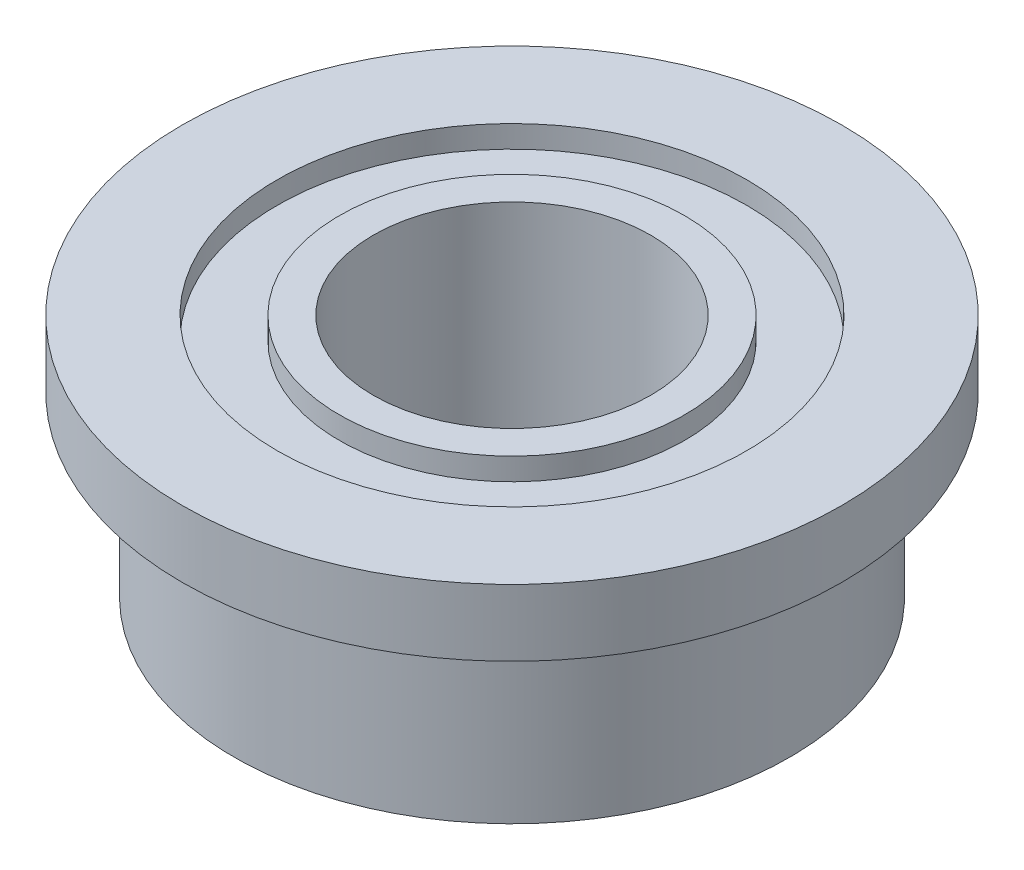
ISO-10303-21;
HEADER;
FILE_DESCRIPTION(('STEP AP214'),'2;1');
FILE_NAME('part.step','',(''),(''),'','','');
FILE_SCHEMA(('AUTOMOTIVE_DESIGN { 1 0 10303 214 1 1 1 1 }'));
ENDSEC;
DATA;
#1=APPLICATION_CONTEXT('core data for automotive mechanical design processes');
#2=APPLICATION_PROTOCOL_DEFINITION('international standard','automotive_design',2000,#1);
#3=PRODUCT_CONTEXT('',#1,'mechanical');
#4=PRODUCT('Part','Part','',(#3));
#5=PRODUCT_RELATED_PRODUCT_CATEGORY('part','',(#4));
#6=PRODUCT_DEFINITION_FORMATION('','',#4);
#7=PRODUCT_DEFINITION_CONTEXT('part definition',#1,'design');
#8=PRODUCT_DEFINITION('design','',#6,#7);
#9=PRODUCT_DEFINITION_SHAPE('','',#8);
#10=(LENGTH_UNIT() NAMED_UNIT(*) SI_UNIT(.MILLI.,.METRE.));
#11=(NAMED_UNIT(*) PLANE_ANGLE_UNIT() SI_UNIT($,.RADIAN.));
#12=(NAMED_UNIT(*) SI_UNIT($,.STERADIAN.) SOLID_ANGLE_UNIT());
#13=UNCERTAINTY_MEASURE_WITH_UNIT(LENGTH_MEASURE(1.E-05),#10,'distance_accuracy_value','');
#14=(GEOMETRIC_REPRESENTATION_CONTEXT(3) GLOBAL_UNCERTAINTY_ASSIGNED_CONTEXT((#13)) GLOBAL_UNIT_ASSIGNED_CONTEXT((#10,
#11,#12)) REPRESENTATION_CONTEXT('',''));
#15=CARTESIAN_POINT('',(0.,0.,0.));
#16=DIRECTION('',(0.,0.,1.));
#17=DIRECTION('',(1.,0.,0.));
#18=AXIS2_PLACEMENT_3D('',#15,#16,#17);
#19=CARTESIAN_POINT('',(0.,2.794,0.));
#20=DIRECTION('',(0.,-1.,0.));
#21=DIRECTION('',(0.,0.,-1.));
#22=AXIS2_PLACEMENT_3D('',#19,#20,#21);
#23=CYLINDRICAL_SURFACE('',#22,1.97485);
#24=CARTESIAN_POINT('',(0.,0.254,0.));
#25=DIRECTION('',(0.,-1.,0.));
#26=DIRECTION('',(0.,0.,-1.));
#27=AXIS2_PLACEMENT_3D('',#24,#25,#26);
#28=CIRCLE('',#27,1.97485);
#29=CARTESIAN_POINT('',(0.,0.254,-1.97485));
#30=VERTEX_POINT('',#29);
#31=EDGE_CURVE('E82',#30,#30,#28,.T.);
#32=ORIENTED_EDGE('',*,*,#31,.T.);
#33=EDGE_LOOP('',(#32));
#34=FACE_BOUND('',#33,.T.);
#35=CARTESIAN_POINT('',(0.,0.,0.));
#36=DIRECTION('',(0.,-1.,0.));
#37=DIRECTION('',(0.,0.,-1.));
#38=AXIS2_PLACEMENT_3D('',#35,#36,#37);
#39=CIRCLE('',#38,1.97485);
#40=CARTESIAN_POINT('',(0.,0.,-1.97485));
#41=VERTEX_POINT('',#40);
#42=EDGE_CURVE('E10',#41,#41,#39,.T.);
#43=ORIENTED_EDGE('',*,*,#42,.F.);
#44=EDGE_LOOP('',(#43));
#45=FACE_BOUND('',#44,.T.);
#46=ADVANCED_FACE('F30',(#34,#45),#23,.T.);
#47=CARTESIAN_POINT('',(1.5875,0.,0.));
#48=DIRECTION('',(0.,-1.,0.));
#49=DIRECTION('',(0.,0.,-1.));
#50=AXIS2_PLACEMENT_3D('',#47,#48,#49);
#51=PLANE('',#50);
#52=ORIENTED_EDGE('',*,*,#42,.T.);
#53=EDGE_LOOP('',(#52));
#54=FACE_BOUND('',#53,.T.);
#55=CARTESIAN_POINT('',(0.,0.,0.));
#56=DIRECTION('',(0.,-1.,0.));
#57=DIRECTION('',(0.,0.,-1.));
#58=AXIS2_PLACEMENT_3D('',#55,#56,#57);
#59=CIRCLE('',#58,1.5875);
#60=CARTESIAN_POINT('',(0.,0.,-1.5875));
#61=VERTEX_POINT('',#60);
#62=EDGE_CURVE('E36',#61,#61,#59,.T.);
#63=ORIENTED_EDGE('',*,*,#62,.F.);
#64=EDGE_LOOP('',(#63));
#65=FACE_BOUND('',#64,.T.);
#66=ADVANCED_FACE('F100',(#54,#65),#51,.T.);
#67=CARTESIAN_POINT('',(0.,2.794,0.));
#68=DIRECTION('',(0.,-1.,0.));
#69=DIRECTION('',(0.,0.,-1.));
#70=AXIS2_PLACEMENT_3D('',#67,#68,#69);
#71=CYLINDRICAL_SURFACE('',#70,1.5875);
#72=ORIENTED_EDGE('',*,*,#62,.T.);
#73=EDGE_LOOP('',(#72));
#74=FACE_BOUND('',#73,.T.);
#75=CARTESIAN_POINT('',(0.,2.794,0.));
#76=DIRECTION('',(0.,-1.,0.));
#77=DIRECTION('',(0.,0.,-1.));
#78=AXIS2_PLACEMENT_3D('',#75,#76,#77);
#79=CIRCLE('',#78,1.5875);
#80=CARTESIAN_POINT('',(0.,2.794,-1.5875));
#81=VERTEX_POINT('',#80);
#82=EDGE_CURVE('E40',#81,#81,#79,.T.);
#83=ORIENTED_EDGE('',*,*,#82,.F.);
#84=EDGE_LOOP('',(#83));
#85=FACE_BOUND('',#84,.T.);
#86=ADVANCED_FACE('F104',(#74,#85),#71,.F.);
#87=CARTESIAN_POINT('',(1.97485,2.794,0.));
#88=DIRECTION('',(0.,1.,0.));
#89=DIRECTION('',(0.,0.,1.));
#90=AXIS2_PLACEMENT_3D('',#87,#88,#89);
#91=PLANE('',#90);
#92=ORIENTED_EDGE('',*,*,#82,.T.);
#93=EDGE_LOOP('',(#92));
#94=FACE_BOUND('',#93,.T.);
#95=CARTESIAN_POINT('',(0.,2.794,0.));
#96=DIRECTION('',(0.,-1.,0.));
#97=DIRECTION('',(0.,0.,-1.));
#98=AXIS2_PLACEMENT_3D('',#95,#96,#97);
#99=CIRCLE('',#98,1.97485);
#100=CARTESIAN_POINT('',(0.,2.794,-1.97485));
#101=VERTEX_POINT('',#100);
#102=EDGE_CURVE('E44',#101,#101,#99,.T.);
#103=ORIENTED_EDGE('',*,*,#102,.F.);
#104=EDGE_LOOP('',(#103));
#105=FACE_BOUND('',#104,.T.);
#106=ADVANCED_FACE('F108',(#94,#105),#91,.T.);
#107=CARTESIAN_POINT('',(0.,2.794,0.));
#108=DIRECTION('',(0.,-1.,0.));
#109=DIRECTION('',(0.,0.,-1.));
#110=AXIS2_PLACEMENT_3D('',#107,#108,#109);
#111=CYLINDRICAL_SURFACE('',#110,1.97485);
#112=ORIENTED_EDGE('',*,*,#102,.T.);
#113=EDGE_LOOP('',(#112));
#114=FACE_BOUND('',#113,.T.);
#115=CARTESIAN_POINT('',(0.,2.54,0.));
#116=DIRECTION('',(0.,-1.,0.));
#117=DIRECTION('',(0.,0.,-1.));
#118=AXIS2_PLACEMENT_3D('',#115,#116,#117);
#119=CIRCLE('',#118,1.97485);
#120=CARTESIAN_POINT('',(0.,2.54,-1.97485));
#121=VERTEX_POINT('',#120);
#122=EDGE_CURVE('E49',#121,#121,#119,.T.);
#123=ORIENTED_EDGE('',*,*,#122,.F.);
#124=EDGE_LOOP('',(#123));
#125=FACE_BOUND('',#124,.T.);
#126=ADVANCED_FACE('F114',(#114,#125),#111,.T.);
#127=CARTESIAN_POINT('',(2.68605,2.54,0.));
#128=DIRECTION('',(0.,1.,0.));
#129=DIRECTION('',(0.,0.,1.));
#130=AXIS2_PLACEMENT_3D('',#127,#128,#129);
#131=PLANE('',#130);
#132=ORIENTED_EDGE('',*,*,#122,.T.);
#133=EDGE_LOOP('',(#132));
#134=FACE_BOUND('',#133,.T.);
#135=CARTESIAN_POINT('',(0.,2.54,0.));
#136=DIRECTION('',(0.,-1.,0.));
#137=DIRECTION('',(0.,0.,-1.));
#138=AXIS2_PLACEMENT_3D('',#135,#136,#137);
#139=CIRCLE('',#138,2.68605);
#140=CARTESIAN_POINT('',(0.,2.54,-2.68605));
#141=VERTEX_POINT('',#140);
#142=EDGE_CURVE('E52',#141,#141,#139,.T.);
#143=ORIENTED_EDGE('',*,*,#142,.F.);
#144=EDGE_LOOP('',(#143));
#145=FACE_BOUND('',#144,.T.);
#146=ADVANCED_FACE('F118',(#134,#145),#131,.T.);
#147=CARTESIAN_POINT('',(0.,2.794,0.));
#148=DIRECTION('',(0.,-1.,0.));
#149=DIRECTION('',(0.,0.,-1.));
#150=AXIS2_PLACEMENT_3D('',#147,#148,#149);
#151=CYLINDRICAL_SURFACE('',#150,2.68605);
#152=ORIENTED_EDGE('',*,*,#142,.T.);
#153=EDGE_LOOP('',(#152));
#154=FACE_BOUND('',#153,.T.);
#155=CARTESIAN_POINT('',(0.,2.794,0.));
#156=DIRECTION('',(0.,-1.,0.));
#157=DIRECTION('',(0.,0.,-1.));
#158=AXIS2_PLACEMENT_3D('',#155,#156,#157);
#159=CIRCLE('',#158,2.68605);
#160=CARTESIAN_POINT('',(0.,2.794,-2.68605));
#161=VERTEX_POINT('',#160);
#162=EDGE_CURVE('E55',#161,#161,#159,.T.);
#163=ORIENTED_EDGE('',*,*,#162,.F.);
#164=EDGE_LOOP('',(#163));
#165=FACE_BOUND('',#164,.T.);
#166=ADVANCED_FACE('F122',(#154,#165),#151,.F.);
#167=CARTESIAN_POINT('',(3.7719,2.794,0.));
#168=DIRECTION('',(0.,1.,0.));
#169=DIRECTION('',(0.,0.,1.));
#170=AXIS2_PLACEMENT_3D('',#167,#168,#169);
#171=PLANE('',#170);
#172=ORIENTED_EDGE('',*,*,#162,.T.);
#173=EDGE_LOOP('',(#172));
#174=FACE_BOUND('',#173,.T.);
#175=CARTESIAN_POINT('',(0.,2.794,0.));
#176=DIRECTION('',(0.,-1.,0.));
#177=DIRECTION('',(0.,0.,-1.));
#178=AXIS2_PLACEMENT_3D('',#175,#176,#177);
#179=CIRCLE('',#178,3.7719);
#180=CARTESIAN_POINT('',(0.,2.794,-3.7719));
#181=VERTEX_POINT('',#180);
#182=EDGE_CURVE('E58',#181,#181,#179,.T.);
#183=ORIENTED_EDGE('',*,*,#182,.F.);
#184=EDGE_LOOP('',(#183));
#185=FACE_BOUND('',#184,.T.);
#186=ADVANCED_FACE('F126',(#174,#185),#171,.T.);
#187=CARTESIAN_POINT('',(0.,2.794,0.));
#188=DIRECTION('',(0.,-1.,0.));
#189=DIRECTION('',(0.,0.,-1.));
#190=AXIS2_PLACEMENT_3D('',#187,#188,#189);
#191=CYLINDRICAL_SURFACE('',#190,3.7719);
#192=ORIENTED_EDGE('',*,*,#182,.T.);
#193=EDGE_LOOP('',(#192));
#194=FACE_BOUND('',#193,.T.);
#195=CARTESIAN_POINT('',(0.,2.032,0.));
#196=DIRECTION('',(0.,-1.,0.));
#197=DIRECTION('',(0.,0.,-1.));
#198=AXIS2_PLACEMENT_3D('',#195,#196,#197);
#199=CIRCLE('',#198,3.7719);
#200=CARTESIAN_POINT('',(0.,2.032,-3.7719));
#201=VERTEX_POINT('',#200);
#202=EDGE_CURVE('E61',#201,#201,#199,.T.);
#203=ORIENTED_EDGE('',*,*,#202,.F.);
#204=EDGE_LOOP('',(#203));
#205=FACE_BOUND('',#204,.T.);
#206=ADVANCED_FACE('F130',(#194,#205),#191,.T.);
#207=CARTESIAN_POINT('',(3.0734,2.032,0.));
#208=DIRECTION('',(0.,-1.,0.));
#209=DIRECTION('',(0.,0.,-1.));
#210=AXIS2_PLACEMENT_3D('',#207,#208,#209);
#211=PLANE('',#210);
#212=ORIENTED_EDGE('',*,*,#202,.T.);
#213=EDGE_LOOP('',(#212));
#214=FACE_BOUND('',#213,.T.);
#215=CARTESIAN_POINT('',(0.,2.032,0.));
#216=DIRECTION('',(0.,-1.,0.));
#217=DIRECTION('',(0.,0.,-1.));
#218=AXIS2_PLACEMENT_3D('',#215,#216,#217);
#219=CIRCLE('',#218,3.0734);
#220=CARTESIAN_POINT('',(0.,2.032,-3.0734));
#221=VERTEX_POINT('',#220);
#222=EDGE_CURVE('E64',#221,#221,#219,.T.);
#223=ORIENTED_EDGE('',*,*,#222,.F.);
#224=EDGE_LOOP('',(#223));
#225=FACE_BOUND('',#224,.T.);
#226=ADVANCED_FACE('F134',(#214,#225),#211,.T.);
#227=CARTESIAN_POINT('',(0.,2.794,0.));
#228=DIRECTION('',(0.,-1.,0.));
#229=DIRECTION('',(0.,0.,-1.));
#230=AXIS2_PLACEMENT_3D('',#227,#228,#229);
#231=CYLINDRICAL_SURFACE('',#230,3.0734);
#232=ORIENTED_EDGE('',*,*,#222,.T.);
#233=EDGE_LOOP('',(#232));
#234=FACE_BOUND('',#233,.T.);
#235=CARTESIAN_POINT('',(0.,1.7272,0.));
#236=DIRECTION('',(0.,-1.,0.));
#237=DIRECTION('',(0.,0.,-1.));
#238=AXIS2_PLACEMENT_3D('',#235,#236,#237);
#239=CIRCLE('',#238,3.0734);
#240=CARTESIAN_POINT('',(0.,1.7272,-3.0734));
#241=VERTEX_POINT('',#240);
#242=EDGE_CURVE('E67',#241,#241,#239,.T.);
#243=ORIENTED_EDGE('',*,*,#242,.F.);
#244=EDGE_LOOP('',(#243));
#245=FACE_BOUND('',#244,.T.);
#246=ADVANCED_FACE('F138',(#234,#245),#231,.T.);
#247=CARTESIAN_POINT('',(3.175,1.7272,0.));
#248=DIRECTION('',(0.,1.,0.));
#249=DIRECTION('',(0.,0.,1.));
#250=AXIS2_PLACEMENT_3D('',#247,#248,#249);
#251=PLANE('',#250);
#252=ORIENTED_EDGE('',*,*,#242,.T.);
#253=EDGE_LOOP('',(#252));
#254=FACE_BOUND('',#253,.T.);
#255=CARTESIAN_POINT('',(0.,1.7272,0.));
#256=DIRECTION('',(0.,-1.,0.));
#257=DIRECTION('',(0.,0.,-1.));
#258=AXIS2_PLACEMENT_3D('',#255,#256,#257);
#259=CIRCLE('',#258,3.175);
#260=CARTESIAN_POINT('',(0.,1.7272,-3.175));
#261=VERTEX_POINT('',#260);
#262=EDGE_CURVE('E70',#261,#261,#259,.T.);
#263=ORIENTED_EDGE('',*,*,#262,.F.);
#264=EDGE_LOOP('',(#263));
#265=FACE_BOUND('',#264,.T.);
#266=ADVANCED_FACE('F142',(#254,#265),#251,.T.);
#267=CARTESIAN_POINT('',(0.,2.794,0.));
#268=DIRECTION('',(0.,-1.,0.));
#269=DIRECTION('',(0.,0.,-1.));
#270=AXIS2_PLACEMENT_3D('',#267,#268,#269);
#271=CYLINDRICAL_SURFACE('',#270,3.175);
#272=ORIENTED_EDGE('',*,*,#262,.T.);
#273=EDGE_LOOP('',(#272));
#274=FACE_BOUND('',#273,.T.);
#275=CARTESIAN_POINT('',(0.,0.,0.));
#276=DIRECTION('',(0.,-1.,0.));
#277=DIRECTION('',(0.,0.,-1.));
#278=AXIS2_PLACEMENT_3D('',#275,#276,#277);
#279=CIRCLE('',#278,3.175);
#280=CARTESIAN_POINT('',(0.,0.,-3.175));
#281=VERTEX_POINT('',#280);
#282=EDGE_CURVE('E73',#281,#281,#279,.T.);
#283=ORIENTED_EDGE('',*,*,#282,.F.);
#284=EDGE_LOOP('',(#283));
#285=FACE_BOUND('',#284,.T.);
#286=ADVANCED_FACE('F146',(#274,#285),#271,.T.);
#287=CARTESIAN_POINT('',(2.68605,0.,0.));
#288=DIRECTION('',(0.,-1.,0.));
#289=DIRECTION('',(0.,0.,-1.));
#290=AXIS2_PLACEMENT_3D('',#287,#288,#289);
#291=PLANE('',#290);
#292=ORIENTED_EDGE('',*,*,#282,.T.);
#293=EDGE_LOOP('',(#292));
#294=FACE_BOUND('',#293,.T.);
#295=CARTESIAN_POINT('',(0.,0.,0.));
#296=DIRECTION('',(0.,-1.,0.));
#297=DIRECTION('',(0.,0.,-1.));
#298=AXIS2_PLACEMENT_3D('',#295,#296,#297);
#299=CIRCLE('',#298,2.68605);
#300=CARTESIAN_POINT('',(0.,0.,-2.68605));
#301=VERTEX_POINT('',#300);
#302=EDGE_CURVE('E76',#301,#301,#299,.T.);
#303=ORIENTED_EDGE('',*,*,#302,.F.);
#304=EDGE_LOOP('',(#303));
#305=FACE_BOUND('',#304,.T.);
#306=ADVANCED_FACE('F96',(#294,#305),#291,.T.);
#307=CARTESIAN_POINT('',(0.,2.794,0.));
#308=DIRECTION('',(0.,-1.,0.));
#309=DIRECTION('',(0.,0.,-1.));
#310=AXIS2_PLACEMENT_3D('',#307,#308,#309);
#311=CYLINDRICAL_SURFACE('',#310,2.68605);
#312=ORIENTED_EDGE('',*,*,#302,.T.);
#313=EDGE_LOOP('',(#312));
#314=FACE_BOUND('',#313,.T.);
#315=CARTESIAN_POINT('',(0.,0.254,0.));
#316=DIRECTION('',(0.,-1.,0.));
#317=DIRECTION('',(0.,0.,-1.));
#318=AXIS2_PLACEMENT_3D('',#315,#316,#317);
#319=CIRCLE('',#318,2.68605);
#320=CARTESIAN_POINT('',(0.,0.254,-2.68605));
#321=VERTEX_POINT('',#320);
#322=EDGE_CURVE('E79',#321,#321,#319,.T.);
#323=ORIENTED_EDGE('',*,*,#322,.F.);
#324=EDGE_LOOP('',(#323));
#325=FACE_BOUND('',#324,.T.);
#326=ADVANCED_FACE('F90',(#314,#325),#311,.F.);
#327=CARTESIAN_POINT('',(1.97485,0.254,0.));
#328=DIRECTION('',(0.,-1.,0.));
#329=DIRECTION('',(0.,0.,-1.));
#330=AXIS2_PLACEMENT_3D('',#327,#328,#329);
#331=PLANE('',#330);
#332=ORIENTED_EDGE('',*,*,#322,.T.);
#333=EDGE_LOOP('',(#332));
#334=FACE_BOUND('',#333,.T.);
#335=ORIENTED_EDGE('',*,*,#31,.F.);
#336=EDGE_LOOP('',(#335));
#337=FACE_BOUND('',#336,.T.);
#338=ADVANCED_FACE('F88',(#334,#337),#331,.T.);
#339=CLOSED_SHELL('',(#46,#66,#86,#106,#126,#146,#166,#186,#206,#226,#246,#266,#286,#306,#326,#338));
#340=MANIFOLD_SOLID_BREP('B2',#339);
#341=ADVANCED_BREP_SHAPE_REPRESENTATION('',(#18,#340),#14);
#342=SHAPE_DEFINITION_REPRESENTATION(#9,#341);
ENDSEC;
END-ISO-10303-21;
